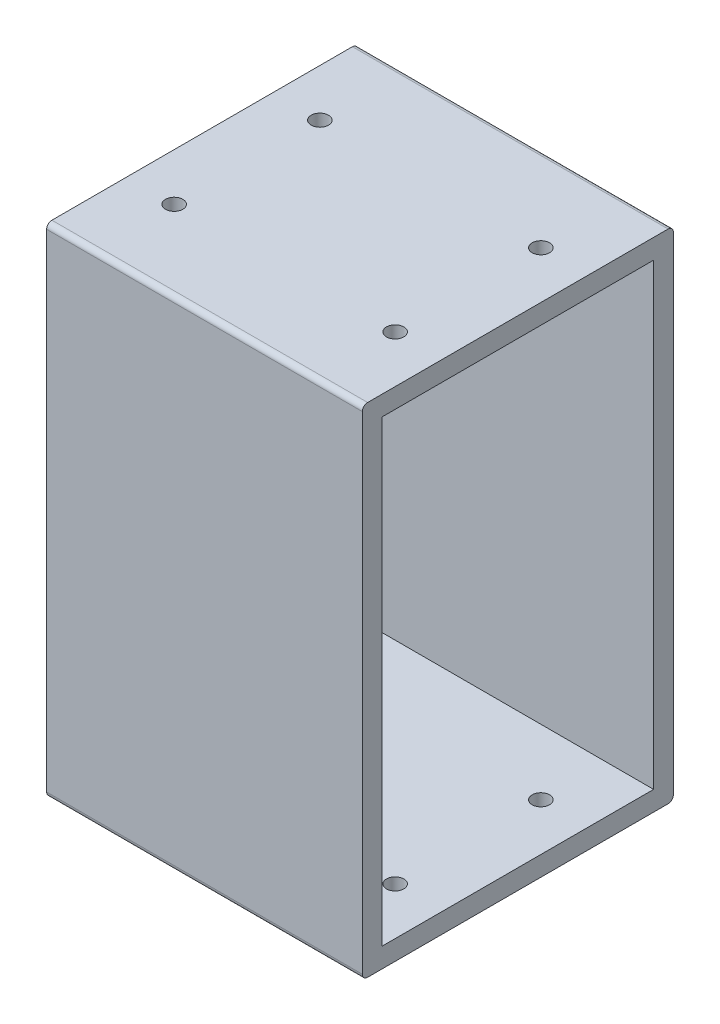
ISO-10303-21;
HEADER;
FILE_DESCRIPTION(('STEP AP214'),'2;1');
FILE_NAME('part.step','',(''),(''),'','','');
FILE_SCHEMA(('AUTOMOTIVE_DESIGN { 1 0 10303 214 1 1 1 1 }'));
ENDSEC;
DATA;
#1=APPLICATION_CONTEXT('core data for automotive mechanical design processes');
#2=APPLICATION_PROTOCOL_DEFINITION('international standard','automotive_design',2000,#1);
#3=PRODUCT_CONTEXT('',#1,'mechanical');
#4=PRODUCT('Part','Part','',(#3));
#5=PRODUCT_RELATED_PRODUCT_CATEGORY('part','',(#4));
#6=PRODUCT_DEFINITION_FORMATION('','',#4);
#7=PRODUCT_DEFINITION_CONTEXT('part definition',#1,'design');
#8=PRODUCT_DEFINITION('design','',#6,#7);
#9=PRODUCT_DEFINITION_SHAPE('','',#8);
#10=(LENGTH_UNIT() NAMED_UNIT(*) SI_UNIT(.MILLI.,.METRE.));
#11=(NAMED_UNIT(*) PLANE_ANGLE_UNIT() SI_UNIT($,.RADIAN.));
#12=(NAMED_UNIT(*) SI_UNIT($,.STERADIAN.) SOLID_ANGLE_UNIT());
#13=UNCERTAINTY_MEASURE_WITH_UNIT(LENGTH_MEASURE(1.E-05),#10,'distance_accuracy_value','');
#14=(GEOMETRIC_REPRESENTATION_CONTEXT(3) GLOBAL_UNCERTAINTY_ASSIGNED_CONTEXT((#13)) GLOBAL_UNIT_ASSIGNED_CONTEXT((#10,
#11,#12)) REPRESENTATION_CONTEXT('',''));
#15=CARTESIAN_POINT('',(0.,0.,0.));
#16=DIRECTION('',(0.,0.,1.));
#17=DIRECTION('',(1.,0.,0.));
#18=AXIS2_PLACEMENT_3D('',#15,#16,#17);
#19=CARTESIAN_POINT('',(76.2,-60.071,-37.5285));
#20=DIRECTION('',(0.,0.,1.));
#21=DIRECTION('',(1.,0.,0.));
#22=AXIS2_PLACEMENT_3D('',#19,#20,#21);
#23=PLANE('',#22);
#24=DIRECTION('',(0.,1.,0.));
#25=VECTOR('',#24,1.);
#26=CARTESIAN_POINT('',(76.2,-60.071,-37.5285));
#27=LINE('',#26,#25);
#28=CARTESIAN_POINT('',(76.2,-58.801,-37.5285));
#29=VERTEX_POINT('',#28);
#30=CARTESIAN_POINT('',(76.2,58.801,-37.5285));
#31=VERTEX_POINT('',#30);
#32=EDGE_CURVE('E172',#29,#31,#27,.T.);
#33=ORIENTED_EDGE('',*,*,#32,.F.);
#34=DIRECTION('',(-1.,0.,0.));
#35=VECTOR('',#34,1.);
#36=CARTESIAN_POINT('',(76.2,-58.801,-37.5285));
#37=LINE('',#36,#35);
#38=CARTESIAN_POINT('',(0.,-58.801,-37.5285));
#39=VERTEX_POINT('',#38);
#40=EDGE_CURVE('E194',#29,#39,#37,.T.);
#41=ORIENTED_EDGE('',*,*,#40,.T.);
#42=DIRECTION('',(0.,1.,0.));
#43=VECTOR('',#42,1.);
#44=CARTESIAN_POINT('',(0.,-60.071,-37.5285));
#45=LINE('',#44,#43);
#46=CARTESIAN_POINT('',(0.,58.801,-37.5285));
#47=VERTEX_POINT('',#46);
#48=EDGE_CURVE('E149',#39,#47,#45,.T.);
#49=ORIENTED_EDGE('',*,*,#48,.T.);
#50=DIRECTION('',(-1.,0.,0.));
#51=VECTOR('',#50,1.);
#52=CARTESIAN_POINT('',(76.2,58.801,-37.5285));
#53=LINE('',#52,#51);
#54=EDGE_CURVE('E183',#47,#31,#53,.F.);
#55=ORIENTED_EDGE('',*,*,#54,.T.);
#56=EDGE_LOOP('',(#33,#41,#49,#55));
#57=FACE_BOUND('',#56,.T.);
#58=ADVANCED_FACE('F38',(#57),#23,.F.);
#59=CARTESIAN_POINT('',(76.2,60.071,37.5285));
#60=DIRECTION('',(0.,-1.,0.));
#61=DIRECTION('',(0.,0.,-1.));
#62=AXIS2_PLACEMENT_3D('',#59,#60,#61);
#63=PLANE('',#62);
#64=CARTESIAN_POINT('',(64.77,60.071,18.1864));
#65=DIRECTION('',(0.,-1.,0.));
#66=DIRECTION('',(0.,0.,-1.));
#67=AXIS2_PLACEMENT_3D('',#64,#65,#66);
#68=CIRCLE('',#67,2.0955);
#69=CARTESIAN_POINT('',(64.77,60.071,16.0909));
#70=VERTEX_POINT('',#69);
#71=EDGE_CURVE('E373',#70,#70,#68,.T.);
#72=ORIENTED_EDGE('',*,*,#71,.T.);
#73=EDGE_LOOP('',(#72));
#74=FACE_BOUND('',#73,.T.);
#75=CARTESIAN_POINT('',(11.43,60.071,-16.9799));
#76=DIRECTION('',(0.,-1.,0.));
#77=DIRECTION('',(0.,0.,-1.));
#78=AXIS2_PLACEMENT_3D('',#75,#76,#77);
#79=CIRCLE('',#78,2.0955);
#80=CARTESIAN_POINT('',(11.43,60.071,-19.0754));
#81=VERTEX_POINT('',#80);
#82=EDGE_CURVE('E370',#81,#81,#79,.T.);
#83=ORIENTED_EDGE('',*,*,#82,.T.);
#84=EDGE_LOOP('',(#83));
#85=FACE_BOUND('',#84,.T.);
#86=CARTESIAN_POINT('',(64.77,60.071,-16.9799));
#87=DIRECTION('',(0.,-1.,0.));
#88=DIRECTION('',(0.,0.,-1.));
#89=AXIS2_PLACEMENT_3D('',#86,#87,#88);
#90=CIRCLE('',#89,2.0955);
#91=CARTESIAN_POINT('',(64.77,60.071,-19.0754));
#92=VERTEX_POINT('',#91);
#93=EDGE_CURVE('E363',#92,#92,#90,.T.);
#94=ORIENTED_EDGE('',*,*,#93,.T.);
#95=EDGE_LOOP('',(#94));
#96=FACE_BOUND('',#95,.T.);
#97=CARTESIAN_POINT('',(11.43,60.071,18.1864));
#98=DIRECTION('',(0.,-1.,0.));
#99=DIRECTION('',(0.,0.,-1.));
#100=AXIS2_PLACEMENT_3D('',#97,#98,#99);
#101=CIRCLE('',#100,2.0955);
#102=CARTESIAN_POINT('',(11.43,60.071,16.0909));
#103=VERTEX_POINT('',#102);
#104=EDGE_CURVE('E228',#103,#103,#101,.T.);
#105=ORIENTED_EDGE('',*,*,#104,.T.);
#106=EDGE_LOOP('',(#105));
#107=FACE_BOUND('',#106,.T.);
#108=DIRECTION('',(0.,0.,1.));
#109=VECTOR('',#108,1.);
#110=CARTESIAN_POINT('',(76.2,60.071,37.5285));
#111=LINE('',#110,#109);
#112=CARTESIAN_POINT('',(76.2,60.071,-36.2585));
#113=VERTEX_POINT('',#112);
#114=CARTESIAN_POINT('',(76.2,60.071,36.2585));
#115=VERTEX_POINT('',#114);
#116=EDGE_CURVE('E175',#113,#115,#111,.T.);
#117=ORIENTED_EDGE('',*,*,#116,.F.);
#118=DIRECTION('',(-1.,0.,0.));
#119=VECTOR('',#118,1.);
#120=CARTESIAN_POINT('',(76.2,60.071,-36.2585));
#121=LINE('',#120,#119);
#122=CARTESIAN_POINT('',(0.,60.071,-36.2585));
#123=VERTEX_POINT('',#122);
#124=EDGE_CURVE('E219',#113,#123,#121,.T.);
#125=ORIENTED_EDGE('',*,*,#124,.T.);
#126=DIRECTION('',(0.,0.,1.));
#127=VECTOR('',#126,1.);
#128=CARTESIAN_POINT('',(0.,60.071,37.5285));
#129=LINE('',#128,#127);
#130=CARTESIAN_POINT('',(0.,60.071,36.2585));
#131=VERTEX_POINT('',#130);
#132=EDGE_CURVE('E186',#123,#131,#129,.T.);
#133=ORIENTED_EDGE('',*,*,#132,.T.);
#134=DIRECTION('',(-1.,0.,0.));
#135=VECTOR('',#134,1.);
#136=CARTESIAN_POINT('',(76.2,60.071,36.2585));
#137=LINE('',#136,#135);
#138=EDGE_CURVE('E217',#131,#115,#137,.F.);
#139=ORIENTED_EDGE('',*,*,#138,.T.);
#140=EDGE_LOOP('',(#117,#125,#133,#139));
#141=FACE_BOUND('',#140,.T.);
#142=ADVANCED_FACE('F281',(#74,#85,#96,#107,#141),#63,.F.);
#143=CARTESIAN_POINT('',(76.2,-60.071,37.5285));
#144=DIRECTION('',(0.,0.,-1.));
#145=DIRECTION('',(-1.,0.,0.));
#146=AXIS2_PLACEMENT_3D('',#143,#144,#145);
#147=PLANE('',#146);
#148=DIRECTION('',(0.,-1.,0.));
#149=VECTOR('',#148,1.);
#150=CARTESIAN_POINT('',(0.,-60.071,37.5285));
#151=LINE('',#150,#149);
#152=CARTESIAN_POINT('',(0.,58.801,37.5285));
#153=VERTEX_POINT('',#152);
#154=CARTESIAN_POINT('',(0.,-58.801,37.5285));
#155=VERTEX_POINT('',#154);
#156=EDGE_CURVE('E189',#153,#155,#151,.T.);
#157=ORIENTED_EDGE('',*,*,#156,.T.);
#158=DIRECTION('',(-1.,0.,0.));
#159=VECTOR('',#158,1.);
#160=CARTESIAN_POINT('',(76.2,-58.801,37.5285));
#161=LINE('',#160,#159);
#162=CARTESIAN_POINT('',(76.2,-58.801,37.5285));
#163=VERTEX_POINT('',#162);
#164=EDGE_CURVE('E11',#155,#163,#161,.F.);
#165=ORIENTED_EDGE('',*,*,#164,.T.);
#166=DIRECTION('',(0.,-1.,0.));
#167=VECTOR('',#166,1.);
#168=CARTESIAN_POINT('',(76.2,-60.071,37.5285));
#169=LINE('',#168,#167);
#170=CARTESIAN_POINT('',(76.2,58.801,37.5285));
#171=VERTEX_POINT('',#170);
#172=EDGE_CURVE('E178',#171,#163,#169,.T.);
#173=ORIENTED_EDGE('',*,*,#172,.F.);
#174=DIRECTION('',(-1.,0.,0.));
#175=VECTOR('',#174,1.);
#176=CARTESIAN_POINT('',(76.2,58.801,37.5285));
#177=LINE('',#176,#175);
#178=EDGE_CURVE('E47',#171,#153,#177,.T.);
#179=ORIENTED_EDGE('',*,*,#178,.T.);
#180=EDGE_LOOP('',(#157,#165,#173,#179));
#181=FACE_BOUND('',#180,.T.);
#182=ADVANCED_FACE('F286',(#181),#147,.F.);
#183=CARTESIAN_POINT('',(76.2,-60.071,37.5285));
#184=DIRECTION('',(0.,1.,0.));
#185=DIRECTION('',(0.,0.,1.));
#186=AXIS2_PLACEMENT_3D('',#183,#184,#185);
#187=PLANE('',#186);
#188=CARTESIAN_POINT('',(64.77,-60.071,18.1864));
#189=DIRECTION('',(0.,1.,0.));
#190=DIRECTION('',(0.,0.,1.));
#191=AXIS2_PLACEMENT_3D('',#188,#189,#190);
#192=CIRCLE('',#191,2.0955);
#193=CARTESIAN_POINT('',(64.77,-60.071,20.2819));
#194=VERTEX_POINT('',#193);
#195=EDGE_CURVE('E255',#194,#194,#192,.T.);
#196=ORIENTED_EDGE('',*,*,#195,.T.);
#197=EDGE_LOOP('',(#196));
#198=FACE_BOUND('',#197,.T.);
#199=CARTESIAN_POINT('',(11.43,-60.071,-16.9799));
#200=DIRECTION('',(0.,1.,0.));
#201=DIRECTION('',(0.,0.,1.));
#202=AXIS2_PLACEMENT_3D('',#199,#200,#201);
#203=CIRCLE('',#202,2.0955);
#204=CARTESIAN_POINT('',(11.43,-60.071,-14.8844));
#205=VERTEX_POINT('',#204);
#206=EDGE_CURVE('E240',#205,#205,#203,.T.);
#207=ORIENTED_EDGE('',*,*,#206,.T.);
#208=EDGE_LOOP('',(#207));
#209=FACE_BOUND('',#208,.T.);
#210=CARTESIAN_POINT('',(64.77,-60.071,-16.9799));
#211=DIRECTION('',(0.,1.,0.));
#212=DIRECTION('',(0.,0.,1.));
#213=AXIS2_PLACEMENT_3D('',#210,#211,#212);
#214=CIRCLE('',#213,2.0955);
#215=CARTESIAN_POINT('',(64.77,-60.071,-14.8844));
#216=VERTEX_POINT('',#215);
#217=EDGE_CURVE('E236',#216,#216,#214,.T.);
#218=ORIENTED_EDGE('',*,*,#217,.T.);
#219=EDGE_LOOP('',(#218));
#220=FACE_BOUND('',#219,.T.);
#221=CARTESIAN_POINT('',(11.43,-60.071,18.1864));
#222=DIRECTION('',(0.,1.,0.));
#223=DIRECTION('',(0.,0.,1.));
#224=AXIS2_PLACEMENT_3D('',#221,#222,#223);
#225=CIRCLE('',#224,2.0955);
#226=CARTESIAN_POINT('',(11.43,-60.071,20.2819));
#227=VERTEX_POINT('',#226);
#228=EDGE_CURVE('E232',#227,#227,#225,.T.);
#229=ORIENTED_EDGE('',*,*,#228,.T.);
#230=EDGE_LOOP('',(#229));
#231=FACE_BOUND('',#230,.T.);
#232=DIRECTION('',(0.,0.,-1.));
#233=VECTOR('',#232,1.);
#234=CARTESIAN_POINT('',(0.,-60.071,37.5285));
#235=LINE('',#234,#233);
#236=CARTESIAN_POINT('',(0.,-60.071,36.2585));
#237=VERTEX_POINT('',#236);
#238=CARTESIAN_POINT('',(0.,-60.071,-36.2585));
#239=VERTEX_POINT('',#238);
#240=EDGE_CURVE('E176',#237,#239,#235,.T.);
#241=ORIENTED_EDGE('',*,*,#240,.T.);
#242=DIRECTION('',(-1.,0.,0.));
#243=VECTOR('',#242,1.);
#244=CARTESIAN_POINT('',(76.2,-60.071,-36.2585));
#245=LINE('',#244,#243);
#246=CARTESIAN_POINT('',(76.2,-60.071,-36.2585));
#247=VERTEX_POINT('',#246);
#248=EDGE_CURVE('E208',#239,#247,#245,.F.);
#249=ORIENTED_EDGE('',*,*,#248,.T.);
#250=DIRECTION('',(0.,0.,-1.));
#251=VECTOR('',#250,1.);
#252=CARTESIAN_POINT('',(76.2,-60.071,37.5285));
#253=LINE('',#252,#251);
#254=CARTESIAN_POINT('',(76.2,-60.071,36.2585));
#255=VERTEX_POINT('',#254);
#256=EDGE_CURVE('E180',#255,#247,#253,.T.);
#257=ORIENTED_EDGE('',*,*,#256,.F.);
#258=DIRECTION('',(-1.,0.,0.));
#259=VECTOR('',#258,1.);
#260=CARTESIAN_POINT('',(76.2,-60.071,36.2585));
#261=LINE('',#260,#259);
#262=EDGE_CURVE('E205',#255,#237,#261,.T.);
#263=ORIENTED_EDGE('',*,*,#262,.T.);
#264=EDGE_LOOP('',(#241,#249,#257,#263));
#265=FACE_BOUND('',#264,.T.);
#266=ADVANCED_FACE('F293',(#198,#209,#220,#231,#265),#187,.F.);
#267=CARTESIAN_POINT('',(76.2,0.,0.));
#268=DIRECTION('',(-1.,0.,0.));
#269=DIRECTION('',(0.,0.,1.));
#270=AXIS2_PLACEMENT_3D('',#267,#268,#269);
#271=PLANE('',#270);
#272=DIRECTION('',(0.,0.,-1.));
#273=VECTOR('',#272,1.);
#274=CARTESIAN_POINT('',(76.2,-55.3085,-32.766));
#275=LINE('',#274,#273);
#276=CARTESIAN_POINT('',(76.2,-55.3085,32.766));
#277=VERTEX_POINT('',#276);
#278=CARTESIAN_POINT('',(76.2,-55.3085,-32.766));
#279=VERTEX_POINT('',#278);
#280=EDGE_CURVE('E154',#277,#279,#275,.T.);
#281=ORIENTED_EDGE('',*,*,#280,.F.);
#282=DIRECTION('',(0.,-1.,0.));
#283=VECTOR('',#282,1.);
#284=CARTESIAN_POINT('',(76.2,-55.3085,32.766));
#285=LINE('',#284,#283);
#286=CARTESIAN_POINT('',(76.2,55.3085,32.766));
#287=VERTEX_POINT('',#286);
#288=EDGE_CURVE('E133',#287,#277,#285,.T.);
#289=ORIENTED_EDGE('',*,*,#288,.F.);
#290=DIRECTION('',(0.,0.,1.));
#291=VECTOR('',#290,1.);
#292=CARTESIAN_POINT('',(76.2,55.3085,-32.766));
#293=LINE('',#292,#291);
#294=CARTESIAN_POINT('',(76.2,55.3085,-32.766));
#295=VERTEX_POINT('',#294);
#296=EDGE_CURVE('E145',#295,#287,#293,.T.);
#297=ORIENTED_EDGE('',*,*,#296,.F.);
#298=DIRECTION('',(0.,1.,0.));
#299=VECTOR('',#298,1.);
#300=CARTESIAN_POINT('',(76.2,55.3085,-32.766));
#301=LINE('',#300,#299);
#302=EDGE_CURVE('E158',#279,#295,#301,.T.);
#303=ORIENTED_EDGE('',*,*,#302,.F.);
#304=EDGE_LOOP('',(#281,#289,#297,#303));
#305=FACE_BOUND('',#304,.T.);
#306=ORIENTED_EDGE('',*,*,#256,.T.);
#307=CARTESIAN_POINT('',(76.2,-58.801,-36.2585));
#308=DIRECTION('',(-1.,0.,0.));
#309=DIRECTION('',(0.,0.,1.));
#310=AXIS2_PLACEMENT_3D('',#307,#308,#309);
#311=CIRCLE('',#310,1.27);
#312=EDGE_CURVE('E215',#247,#29,#311,.F.);
#313=ORIENTED_EDGE('',*,*,#312,.T.);
#314=ORIENTED_EDGE('',*,*,#32,.T.);
#315=CARTESIAN_POINT('',(76.2,58.801,-36.2585));
#316=DIRECTION('',(-1.,0.,0.));
#317=DIRECTION('',(0.,0.,1.));
#318=AXIS2_PLACEMENT_3D('',#315,#316,#317);
#319=CIRCLE('',#318,1.27);
#320=EDGE_CURVE('E213',#31,#113,#319,.F.);
#321=ORIENTED_EDGE('',*,*,#320,.T.);
#322=ORIENTED_EDGE('',*,*,#116,.T.);
#323=CARTESIAN_POINT('',(76.2,58.801,36.2585));
#324=DIRECTION('',(-1.,0.,0.));
#325=DIRECTION('',(0.,0.,1.));
#326=AXIS2_PLACEMENT_3D('',#323,#324,#325);
#327=CIRCLE('',#326,1.27);
#328=EDGE_CURVE('E60',#115,#171,#327,.F.);
#329=ORIENTED_EDGE('',*,*,#328,.T.);
#330=ORIENTED_EDGE('',*,*,#172,.T.);
#331=CARTESIAN_POINT('',(76.2,-58.801,36.2585));
#332=DIRECTION('',(-1.,0.,0.));
#333=DIRECTION('',(0.,0.,1.));
#334=AXIS2_PLACEMENT_3D('',#331,#332,#333);
#335=CIRCLE('',#334,1.27);
#336=EDGE_CURVE('E211',#163,#255,#335,.F.);
#337=ORIENTED_EDGE('',*,*,#336,.T.);
#338=EDGE_LOOP('',(#306,#313,#314,#321,#322,#329,#330,#337));
#339=FACE_BOUND('',#338,.T.);
#340=ADVANCED_FACE('F152',(#305,#339),#271,.F.);
#341=CARTESIAN_POINT('',(0.,0.,0.));
#342=DIRECTION('',(-1.,0.,0.));
#343=DIRECTION('',(0.,0.,1.));
#344=AXIS2_PLACEMENT_3D('',#341,#342,#343);
#345=PLANE('',#344);
#346=DIRECTION('',(0.,1.,0.));
#347=VECTOR('',#346,1.);
#348=CARTESIAN_POINT('',(0.,-55.3085,32.766));
#349=LINE('',#348,#347);
#350=CARTESIAN_POINT('',(0.,-55.3085,32.766));
#351=VERTEX_POINT('',#350);
#352=CARTESIAN_POINT('',(0.,55.3085,32.766));
#353=VERTEX_POINT('',#352);
#354=EDGE_CURVE('E136',#351,#353,#349,.T.);
#355=ORIENTED_EDGE('',*,*,#354,.F.);
#356=DIRECTION('',(0.,0.,1.));
#357=VECTOR('',#356,1.);
#358=CARTESIAN_POINT('',(0.,-55.3085,-32.766));
#359=LINE('',#358,#357);
#360=CARTESIAN_POINT('',(0.,-55.3085,-32.766));
#361=VERTEX_POINT('',#360);
#362=EDGE_CURVE('E141',#361,#351,#359,.T.);
#363=ORIENTED_EDGE('',*,*,#362,.F.);
#364=DIRECTION('',(0.,-1.,0.));
#365=VECTOR('',#364,1.);
#366=CARTESIAN_POINT('',(0.,55.3085,-32.766));
#367=LINE('',#366,#365);
#368=CARTESIAN_POINT('',(0.,55.3085,-32.766));
#369=VERTEX_POINT('',#368);
#370=EDGE_CURVE('E163',#369,#361,#367,.T.);
#371=ORIENTED_EDGE('',*,*,#370,.F.);
#372=DIRECTION('',(0.,0.,-1.));
#373=VECTOR('',#372,1.);
#374=CARTESIAN_POINT('',(0.,55.3085,-32.766));
#375=LINE('',#374,#373);
#376=EDGE_CURVE('E156',#353,#369,#375,.T.);
#377=ORIENTED_EDGE('',*,*,#376,.F.);
#378=EDGE_LOOP('',(#355,#363,#371,#377));
#379=FACE_BOUND('',#378,.T.);
#380=ORIENTED_EDGE('',*,*,#48,.F.);
#381=CARTESIAN_POINT('',(0.,-58.801,-36.2585));
#382=DIRECTION('',(-1.,0.,0.));
#383=DIRECTION('',(0.,0.,1.));
#384=AXIS2_PLACEMENT_3D('',#381,#382,#383);
#385=CIRCLE('',#384,1.27);
#386=EDGE_CURVE('E203',#39,#239,#385,.T.);
#387=ORIENTED_EDGE('',*,*,#386,.T.);
#388=ORIENTED_EDGE('',*,*,#240,.F.);
#389=CARTESIAN_POINT('',(0.,-58.801,36.2585));
#390=DIRECTION('',(-1.,0.,0.));
#391=DIRECTION('',(0.,0.,1.));
#392=AXIS2_PLACEMENT_3D('',#389,#390,#391);
#393=CIRCLE('',#392,1.27);
#394=EDGE_CURVE('E199',#237,#155,#393,.T.);
#395=ORIENTED_EDGE('',*,*,#394,.T.);
#396=ORIENTED_EDGE('',*,*,#156,.F.);
#397=CARTESIAN_POINT('',(0.,58.801,36.2585));
#398=DIRECTION('',(-1.,0.,0.));
#399=DIRECTION('',(0.,0.,1.));
#400=AXIS2_PLACEMENT_3D('',#397,#398,#399);
#401=CIRCLE('',#400,1.27);
#402=EDGE_CURVE('E197',#153,#131,#401,.T.);
#403=ORIENTED_EDGE('',*,*,#402,.T.);
#404=ORIENTED_EDGE('',*,*,#132,.F.);
#405=CARTESIAN_POINT('',(0.,58.801,-36.2585));
#406=DIRECTION('',(-1.,0.,0.));
#407=DIRECTION('',(0.,0.,1.));
#408=AXIS2_PLACEMENT_3D('',#405,#406,#407);
#409=CIRCLE('',#408,1.27);
#410=EDGE_CURVE('E201',#123,#47,#409,.T.);
#411=ORIENTED_EDGE('',*,*,#410,.T.);
#412=EDGE_LOOP('',(#380,#387,#388,#395,#396,#403,#404,#411));
#413=FACE_BOUND('',#412,.T.);
#414=ADVANCED_FACE('F264',(#379,#413),#345,.T.);
#415=CARTESIAN_POINT('',(76.201,-55.3085,32.766));
#416=DIRECTION('',(0.,0.,1.));
#417=DIRECTION('',(1.,0.,0.));
#418=AXIS2_PLACEMENT_3D('',#415,#416,#417);
#419=PLANE('',#418);
#420=ORIENTED_EDGE('',*,*,#288,.T.);
#421=DIRECTION('',(-1.,0.,0.));
#422=VECTOR('',#421,1.);
#423=CARTESIAN_POINT('',(76.201,-55.3085,32.766));
#424=LINE('',#423,#422);
#425=EDGE_CURVE('E150',#277,#351,#424,.T.);
#426=ORIENTED_EDGE('',*,*,#425,.T.);
#427=ORIENTED_EDGE('',*,*,#354,.T.);
#428=DIRECTION('',(-1.,0.,0.));
#429=VECTOR('',#428,1.);
#430=CARTESIAN_POINT('',(76.201,55.3085,32.766));
#431=LINE('',#430,#429);
#432=EDGE_CURVE('E129',#287,#353,#431,.T.);
#433=ORIENTED_EDGE('',*,*,#432,.F.);
#434=EDGE_LOOP('',(#420,#426,#427,#433));
#435=FACE_BOUND('',#434,.T.);
#436=ADVANCED_FACE('F131',(#435),#419,.F.);
#437=CARTESIAN_POINT('',(76.201,-55.3085,-32.766));
#438=DIRECTION('',(0.,-1.,0.));
#439=DIRECTION('',(0.,0.,-1.));
#440=AXIS2_PLACEMENT_3D('',#437,#438,#439);
#441=PLANE('',#440);
#442=CARTESIAN_POINT('',(64.77,-55.3085,18.1864));
#443=DIRECTION('',(0.,-1.,0.));
#444=DIRECTION('',(0.,0.,-1.));
#445=AXIS2_PLACEMENT_3D('',#442,#443,#444);
#446=CIRCLE('',#445,2.0955);
#447=CARTESIAN_POINT('',(64.77,-55.3085,16.0909));
#448=VERTEX_POINT('',#447);
#449=EDGE_CURVE('E252',#448,#448,#446,.T.);
#450=ORIENTED_EDGE('',*,*,#449,.T.);
#451=EDGE_LOOP('',(#450));
#452=FACE_BOUND('',#451,.T.);
#453=CARTESIAN_POINT('',(11.43,-55.3085,-16.9799));
#454=DIRECTION('',(0.,-1.,0.));
#455=DIRECTION('',(0.,0.,-1.));
#456=AXIS2_PLACEMENT_3D('',#453,#454,#455);
#457=CIRCLE('',#456,2.0955);
#458=CARTESIAN_POINT('',(11.43,-55.3085,-19.0754));
#459=VERTEX_POINT('',#458);
#460=EDGE_CURVE('E235',#459,#459,#457,.T.);
#461=ORIENTED_EDGE('',*,*,#460,.T.);
#462=EDGE_LOOP('',(#461));
#463=FACE_BOUND('',#462,.T.);
#464=CARTESIAN_POINT('',(64.77,-55.3085,-16.9799));
#465=DIRECTION('',(0.,-1.,0.));
#466=DIRECTION('',(0.,0.,-1.));
#467=AXIS2_PLACEMENT_3D('',#464,#465,#466);
#468=CIRCLE('',#467,2.0955);
#469=CARTESIAN_POINT('',(64.77,-55.3085,-19.0754));
#470=VERTEX_POINT('',#469);
#471=EDGE_CURVE('E231',#470,#470,#468,.T.);
#472=ORIENTED_EDGE('',*,*,#471,.T.);
#473=EDGE_LOOP('',(#472));
#474=FACE_BOUND('',#473,.T.);
#475=CARTESIAN_POINT('',(11.43,-55.3085,18.1864));
#476=DIRECTION('',(0.,-1.,0.));
#477=DIRECTION('',(0.,0.,-1.));
#478=AXIS2_PLACEMENT_3D('',#475,#476,#477);
#479=CIRCLE('',#478,2.0955);
#480=CARTESIAN_POINT('',(11.43,-55.3085,16.0909));
#481=VERTEX_POINT('',#480);
#482=EDGE_CURVE('E227',#481,#481,#479,.T.);
#483=ORIENTED_EDGE('',*,*,#482,.T.);
#484=EDGE_LOOP('',(#483));
#485=FACE_BOUND('',#484,.T.);
#486=ORIENTED_EDGE('',*,*,#280,.T.);
#487=DIRECTION('',(-1.,0.,0.));
#488=VECTOR('',#487,1.);
#489=CARTESIAN_POINT('',(76.201,-55.3085,-32.766));
#490=LINE('',#489,#488);
#491=EDGE_CURVE('E169',#279,#361,#490,.T.);
#492=ORIENTED_EDGE('',*,*,#491,.T.);
#493=ORIENTED_EDGE('',*,*,#362,.T.);
#494=ORIENTED_EDGE('',*,*,#425,.F.);
#495=EDGE_LOOP('',(#486,#492,#493,#494));
#496=FACE_BOUND('',#495,.T.);
#497=ADVANCED_FACE('F262',(#452,#463,#474,#485,#496),#441,.F.);
#498=CARTESIAN_POINT('',(76.201,55.3085,-32.766));
#499=DIRECTION('',(0.,0.,-1.));
#500=DIRECTION('',(-1.,0.,0.));
#501=AXIS2_PLACEMENT_3D('',#498,#499,#500);
#502=PLANE('',#501);
#503=ORIENTED_EDGE('',*,*,#302,.T.);
#504=DIRECTION('',(-1.,0.,0.));
#505=VECTOR('',#504,1.);
#506=CARTESIAN_POINT('',(76.201,55.3085,-32.766));
#507=LINE('',#506,#505);
#508=EDGE_CURVE('E140',#295,#369,#507,.T.);
#509=ORIENTED_EDGE('',*,*,#508,.T.);
#510=ORIENTED_EDGE('',*,*,#370,.T.);
#511=ORIENTED_EDGE('',*,*,#491,.F.);
#512=EDGE_LOOP('',(#503,#509,#510,#511));
#513=FACE_BOUND('',#512,.T.);
#514=ADVANCED_FACE('F258',(#513),#502,.F.);
#515=CARTESIAN_POINT('',(76.201,55.3085,-32.766));
#516=DIRECTION('',(0.,1.,0.));
#517=DIRECTION('',(0.,0.,1.));
#518=AXIS2_PLACEMENT_3D('',#515,#516,#517);
#519=PLANE('',#518);
#520=CARTESIAN_POINT('',(64.77,55.3085,18.1864));
#521=DIRECTION('',(0.,1.,0.));
#522=DIRECTION('',(0.,0.,1.));
#523=AXIS2_PLACEMENT_3D('',#520,#521,#522);
#524=CIRCLE('',#523,2.0955);
#525=CARTESIAN_POINT('',(64.77,55.3085,20.2819));
#526=VERTEX_POINT('',#525);
#527=EDGE_CURVE('E42',#526,#526,#524,.T.);
#528=ORIENTED_EDGE('',*,*,#527,.T.);
#529=EDGE_LOOP('',(#528));
#530=FACE_BOUND('',#529,.T.);
#531=CARTESIAN_POINT('',(11.43,55.3085,-16.9799));
#532=DIRECTION('',(0.,1.,0.));
#533=DIRECTION('',(0.,0.,1.));
#534=AXIS2_PLACEMENT_3D('',#531,#532,#533);
#535=CIRCLE('',#534,2.0955);
#536=CARTESIAN_POINT('',(11.43,55.3085,-14.8844));
#537=VERTEX_POINT('',#536);
#538=EDGE_CURVE('E233',#537,#537,#535,.T.);
#539=ORIENTED_EDGE('',*,*,#538,.T.);
#540=EDGE_LOOP('',(#539));
#541=FACE_BOUND('',#540,.T.);
#542=CARTESIAN_POINT('',(64.77,55.3085,-16.9799));
#543=DIRECTION('',(0.,1.,0.));
#544=DIRECTION('',(0.,0.,1.));
#545=AXIS2_PLACEMENT_3D('',#542,#543,#544);
#546=CIRCLE('',#545,2.0955);
#547=CARTESIAN_POINT('',(64.77,55.3085,-14.8844));
#548=VERTEX_POINT('',#547);
#549=EDGE_CURVE('E229',#548,#548,#546,.T.);
#550=ORIENTED_EDGE('',*,*,#549,.T.);
#551=EDGE_LOOP('',(#550));
#552=FACE_BOUND('',#551,.T.);
#553=CARTESIAN_POINT('',(11.43,55.3085,18.1864));
#554=DIRECTION('',(0.,1.,0.));
#555=DIRECTION('',(0.,0.,1.));
#556=AXIS2_PLACEMENT_3D('',#553,#554,#555);
#557=CIRCLE('',#556,2.0955);
#558=CARTESIAN_POINT('',(11.43,55.3085,20.2819));
#559=VERTEX_POINT('',#558);
#560=EDGE_CURVE('E224',#559,#559,#557,.T.);
#561=ORIENTED_EDGE('',*,*,#560,.T.);
#562=EDGE_LOOP('',(#561));
#563=FACE_BOUND('',#562,.T.);
#564=ORIENTED_EDGE('',*,*,#296,.T.);
#565=ORIENTED_EDGE('',*,*,#432,.T.);
#566=ORIENTED_EDGE('',*,*,#376,.T.);
#567=ORIENTED_EDGE('',*,*,#508,.F.);
#568=EDGE_LOOP('',(#564,#565,#566,#567));
#569=FACE_BOUND('',#568,.T.);
#570=ADVANCED_FACE('F146',(#530,#541,#552,#563,#569),#519,.F.);
#571=CARTESIAN_POINT('',(76.2,-58.801,-36.2585));
#572=DIRECTION('',(-1.,0.,0.));
#573=DIRECTION('',(0.,0.,1.));
#574=AXIS2_PLACEMENT_3D('',#571,#572,#573);
#575=CYLINDRICAL_SURFACE('',#574,1.27);
#576=ORIENTED_EDGE('',*,*,#312,.F.);
#577=ORIENTED_EDGE('',*,*,#248,.F.);
#578=ORIENTED_EDGE('',*,*,#386,.F.);
#579=ORIENTED_EDGE('',*,*,#40,.F.);
#580=EDGE_LOOP('',(#576,#577,#578,#579));
#581=FACE_BOUND('',#580,.T.);
#582=ADVANCED_FACE('F297',(#581),#575,.T.);
#583=CARTESIAN_POINT('',(76.2,58.801,-36.2585));
#584=DIRECTION('',(-1.,0.,0.));
#585=DIRECTION('',(0.,0.,1.));
#586=AXIS2_PLACEMENT_3D('',#583,#584,#585);
#587=CYLINDRICAL_SURFACE('',#586,1.27);
#588=ORIENTED_EDGE('',*,*,#320,.F.);
#589=ORIENTED_EDGE('',*,*,#54,.F.);
#590=ORIENTED_EDGE('',*,*,#410,.F.);
#591=ORIENTED_EDGE('',*,*,#124,.F.);
#592=EDGE_LOOP('',(#588,#589,#590,#591));
#593=FACE_BOUND('',#592,.T.);
#594=ADVANCED_FACE('F277',(#593),#587,.T.);
#595=CARTESIAN_POINT('',(76.2,-58.801,36.2585));
#596=DIRECTION('',(-1.,0.,0.));
#597=DIRECTION('',(0.,0.,1.));
#598=AXIS2_PLACEMENT_3D('',#595,#596,#597);
#599=CYLINDRICAL_SURFACE('',#598,1.27);
#600=ORIENTED_EDGE('',*,*,#336,.F.);
#601=ORIENTED_EDGE('',*,*,#164,.F.);
#602=ORIENTED_EDGE('',*,*,#394,.F.);
#603=ORIENTED_EDGE('',*,*,#262,.F.);
#604=EDGE_LOOP('',(#600,#601,#602,#603));
#605=FACE_BOUND('',#604,.T.);
#606=ADVANCED_FACE('F290',(#605),#599,.T.);
#607=CARTESIAN_POINT('',(76.2,58.801,36.2585));
#608=DIRECTION('',(-1.,0.,0.));
#609=DIRECTION('',(0.,0.,1.));
#610=AXIS2_PLACEMENT_3D('',#607,#608,#609);
#611=CYLINDRICAL_SURFACE('',#610,1.27);
#612=ORIENTED_EDGE('',*,*,#328,.F.);
#613=ORIENTED_EDGE('',*,*,#138,.F.);
#614=ORIENTED_EDGE('',*,*,#402,.F.);
#615=ORIENTED_EDGE('',*,*,#178,.F.);
#616=EDGE_LOOP('',(#612,#613,#614,#615));
#617=FACE_BOUND('',#616,.T.);
#618=ADVANCED_FACE('F40',(#617),#611,.T.);
#619=CARTESIAN_POINT('',(11.43,60.071,18.1864));
#620=DIRECTION('',(0.,-1.,0.));
#621=DIRECTION('',(0.,0.,-1.));
#622=AXIS2_PLACEMENT_3D('',#619,#620,#621);
#623=CYLINDRICAL_SURFACE('',#622,2.0955);
#624=ORIENTED_EDGE('',*,*,#104,.F.);
#625=EDGE_LOOP('',(#624));
#626=FACE_BOUND('',#625,.T.);
#627=ORIENTED_EDGE('',*,*,#560,.F.);
#628=EDGE_LOOP('',(#627));
#629=FACE_BOUND('',#628,.T.);
#630=ADVANCED_FACE('F335',(#626,#629),#623,.F.);
#631=CARTESIAN_POINT('',(64.77,60.071,-16.9799));
#632=DIRECTION('',(0.,-1.,0.));
#633=DIRECTION('',(0.,0.,-1.));
#634=AXIS2_PLACEMENT_3D('',#631,#632,#633);
#635=CYLINDRICAL_SURFACE('',#634,2.0955);
#636=ORIENTED_EDGE('',*,*,#93,.F.);
#637=EDGE_LOOP('',(#636));
#638=FACE_BOUND('',#637,.T.);
#639=ORIENTED_EDGE('',*,*,#549,.F.);
#640=EDGE_LOOP('',(#639));
#641=FACE_BOUND('',#640,.T.);
#642=ADVANCED_FACE('F347',(#638,#641),#635,.F.);
#643=CARTESIAN_POINT('',(11.43,60.071,-16.9799));
#644=DIRECTION('',(0.,-1.,0.));
#645=DIRECTION('',(0.,0.,-1.));
#646=AXIS2_PLACEMENT_3D('',#643,#644,#645);
#647=CYLINDRICAL_SURFACE('',#646,2.0955);
#648=ORIENTED_EDGE('',*,*,#82,.F.);
#649=EDGE_LOOP('',(#648));
#650=FACE_BOUND('',#649,.T.);
#651=ORIENTED_EDGE('',*,*,#538,.F.);
#652=EDGE_LOOP('',(#651));
#653=FACE_BOUND('',#652,.T.);
#654=ADVANCED_FACE('F341',(#650,#653),#647,.F.);
#655=CARTESIAN_POINT('',(64.77,60.071,18.1864));
#656=DIRECTION('',(0.,-1.,0.));
#657=DIRECTION('',(0.,0.,-1.));
#658=AXIS2_PLACEMENT_3D('',#655,#656,#657);
#659=CYLINDRICAL_SURFACE('',#658,2.0955);
#660=ORIENTED_EDGE('',*,*,#71,.F.);
#661=EDGE_LOOP('',(#660));
#662=FACE_BOUND('',#661,.T.);
#663=ORIENTED_EDGE('',*,*,#527,.F.);
#664=EDGE_LOOP('',(#663));
#665=FACE_BOUND('',#664,.T.);
#666=ADVANCED_FACE('F333',(#662,#665),#659,.F.);
#667=ORIENTED_EDGE('',*,*,#482,.F.);
#668=EDGE_LOOP('',(#667));
#669=FACE_BOUND('',#668,.T.);
#670=ORIENTED_EDGE('',*,*,#228,.F.);
#671=EDGE_LOOP('',(#670));
#672=FACE_BOUND('',#671,.T.);
#673=ADVANCED_FACE('F329',(#669,#672),#623,.F.);
#674=ORIENTED_EDGE('',*,*,#471,.F.);
#675=EDGE_LOOP('',(#674));
#676=FACE_BOUND('',#675,.T.);
#677=ORIENTED_EDGE('',*,*,#217,.F.);
#678=EDGE_LOOP('',(#677));
#679=FACE_BOUND('',#678,.T.);
#680=ADVANCED_FACE('F332',(#676,#679),#635,.F.);
#681=ORIENTED_EDGE('',*,*,#460,.F.);
#682=EDGE_LOOP('',(#681));
#683=FACE_BOUND('',#682,.T.);
#684=ORIENTED_EDGE('',*,*,#206,.F.);
#685=EDGE_LOOP('',(#684));
#686=FACE_BOUND('',#685,.T.);
#687=ADVANCED_FACE('F336',(#683,#686),#647,.F.);
#688=ORIENTED_EDGE('',*,*,#449,.F.);
#689=EDGE_LOOP('',(#688));
#690=FACE_BOUND('',#689,.T.);
#691=ORIENTED_EDGE('',*,*,#195,.F.);
#692=EDGE_LOOP('',(#691));
#693=FACE_BOUND('',#692,.T.);
#694=ADVANCED_FACE('F339',(#690,#693),#659,.F.);
#695=CLOSED_SHELL('',(#58,#142,#182,#266,#340,#414,#436,#497,#514,#570,#582,#594,#606,#618,#630,
#642,#654,#666,#673,#680,#687,#694));
#696=MANIFOLD_SOLID_BREP('B2',#695);
#697=ADVANCED_BREP_SHAPE_REPRESENTATION('',(#18,#696),#14);
#698=SHAPE_DEFINITION_REPRESENTATION(#9,#697);
ENDSEC;
END-ISO-10303-21;
